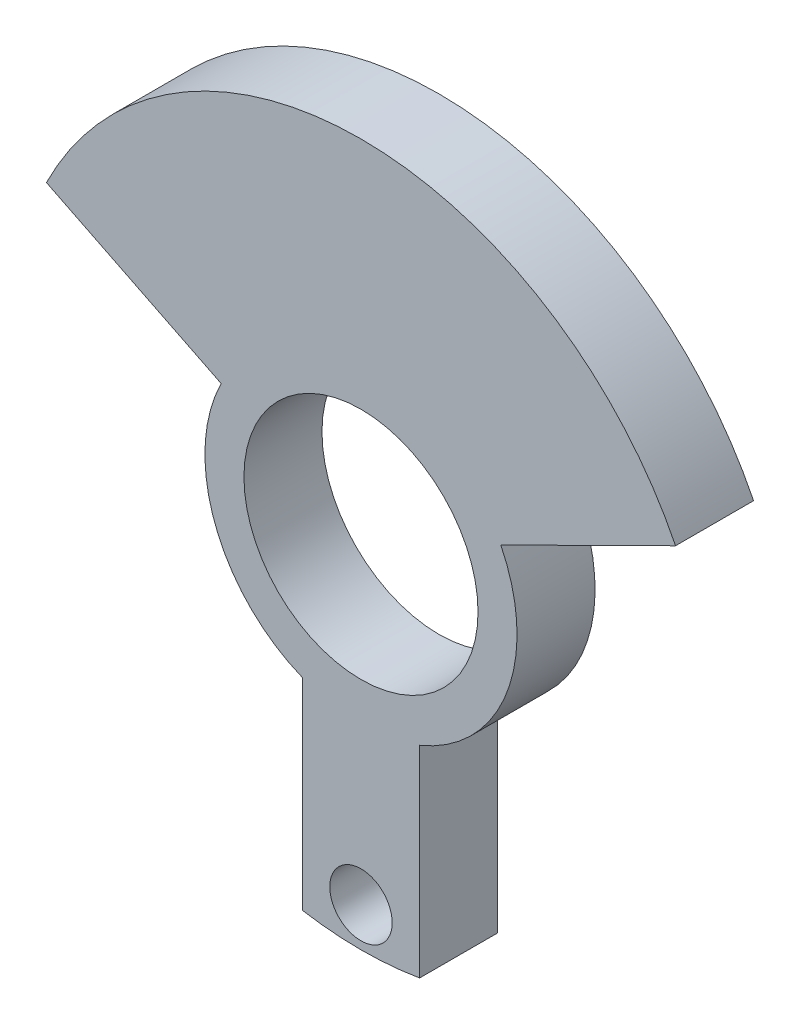
ISO-10303-21;
HEADER;
FILE_DESCRIPTION(('STEP AP214'),'2;1');
FILE_NAME('part.step','',(''),(''),'','','');
FILE_SCHEMA(('AUTOMOTIVE_DESIGN { 1 0 10303 214 1 1 1 1 }'));
ENDSEC;
DATA;
#1=APPLICATION_CONTEXT('core data for automotive mechanical design processes');
#2=APPLICATION_PROTOCOL_DEFINITION('international standard','automotive_design',2000,#1);
#3=PRODUCT_CONTEXT('',#1,'mechanical');
#4=PRODUCT('Part','Part','',(#3));
#5=PRODUCT_RELATED_PRODUCT_CATEGORY('part','',(#4));
#6=PRODUCT_DEFINITION_FORMATION('','',#4);
#7=PRODUCT_DEFINITION_CONTEXT('part definition',#1,'design');
#8=PRODUCT_DEFINITION('design','',#6,#7);
#9=PRODUCT_DEFINITION_SHAPE('','',#8);
#10=(LENGTH_UNIT() NAMED_UNIT(*) SI_UNIT(.MILLI.,.METRE.));
#11=(NAMED_UNIT(*) PLANE_ANGLE_UNIT() SI_UNIT($,.RADIAN.));
#12=(NAMED_UNIT(*) SI_UNIT($,.STERADIAN.) SOLID_ANGLE_UNIT());
#13=UNCERTAINTY_MEASURE_WITH_UNIT(LENGTH_MEASURE(1.E-05),#10,'distance_accuracy_value','');
#14=(GEOMETRIC_REPRESENTATION_CONTEXT(3) GLOBAL_UNCERTAINTY_ASSIGNED_CONTEXT((#13)) GLOBAL_UNIT_ASSIGNED_CONTEXT((#10,
#11,#12)) REPRESENTATION_CONTEXT('',''));
#15=CARTESIAN_POINT('',(0.,0.,0.));
#16=DIRECTION('',(0.,0.,1.));
#17=DIRECTION('',(1.,0.,0.));
#18=AXIS2_PLACEMENT_3D('',#15,#16,#17);
#19=CARTESIAN_POINT('',(0.,0.,5.));
#20=DIRECTION('',(0.,0.,1.));
#21=DIRECTION('',(1.,0.,0.));
#22=AXIS2_PLACEMENT_3D('',#19,#20,#21);
#23=PLANE('',#22);
#24=CARTESIAN_POINT('',(0.,-40.,5.));
#25=DIRECTION('',(0.,0.,1.));
#26=DIRECTION('',(1.,0.,0.));
#27=AXIS2_PLACEMENT_3D('',#24,#25,#26);
#28=CIRCLE('',#27,4.);
#29=CARTESIAN_POINT('',(4.,-40.,5.));
#30=VERTEX_POINT('',#29);
#31=EDGE_CURVE('E185',#30,#30,#28,.T.);
#32=ORIENTED_EDGE('',*,*,#31,.F.);
#33=EDGE_LOOP('',(#32));
#34=FACE_BOUND('',#33,.T.);
#35=CARTESIAN_POINT('',(0.,0.,5.));
#36=DIRECTION('',(0.,0.,1.));
#37=DIRECTION('',(1.,0.,0.));
#38=AXIS2_PLACEMENT_3D('',#35,#36,#37);
#39=CIRCLE('',#38,45.);
#40=CARTESIAN_POINT('',(40.3112887414928,20.,5.));
#41=VERTEX_POINT('',#40);
#42=CARTESIAN_POINT('',(-40.3112887414928,20.,5.));
#43=VERTEX_POINT('',#42);
#44=EDGE_CURVE('E145',#41,#43,#39,.T.);
#45=ORIENTED_EDGE('',*,*,#44,.T.);
#46=DIRECTION('',(0.895806416477617,-0.444444444444445,0.));
#47=VECTOR('',#46,1.);
#48=CARTESIAN_POINT('',(-40.3112887414928,20.,5.));
#49=LINE('',#48,#47);
#50=CARTESIAN_POINT('',(-17.9161283295523,8.88888888888889,5.));
#51=VERTEX_POINT('',#50);
#52=EDGE_CURVE('E93',#43,#51,#49,.T.);
#53=ORIENTED_EDGE('',*,*,#52,.T.);
#54=CARTESIAN_POINT('',(0.,0.,5.));
#55=DIRECTION('',(0.,0.,1.));
#56=DIRECTION('',(1.,0.,0.));
#57=AXIS2_PLACEMENT_3D('',#54,#55,#56);
#58=CIRCLE('',#57,20.);
#59=CARTESIAN_POINT('',(-7.51279453571881,-18.5353154347066,5.));
#60=VERTEX_POINT('',#59);
#61=EDGE_CURVE('E160',#51,#60,#58,.T.);
#62=ORIENTED_EDGE('',*,*,#61,.T.);
#63=DIRECTION('',(0.,-1.,0.));
#64=VECTOR('',#63,1.);
#65=CARTESIAN_POINT('',(-7.5127945357188,-18.5353154347066,5.));
#66=LINE('',#65,#64);
#67=CARTESIAN_POINT('',(-7.5127945357188,-44.3684338044975,5.));
#68=VERTEX_POINT('',#67);
#69=EDGE_CURVE('E173',#60,#68,#66,.T.);
#70=ORIENTED_EDGE('',*,*,#69,.T.);
#71=CARTESIAN_POINT('',(0.,0.,5.));
#72=DIRECTION('',(0.,0.,1.));
#73=DIRECTION('',(1.,0.,0.));
#74=AXIS2_PLACEMENT_3D('',#71,#72,#73);
#75=CIRCLE('',#74,45.);
#76=CARTESIAN_POINT('',(7.51279453571877,-44.3684338044975,5.));
#77=VERTEX_POINT('',#76);
#78=EDGE_CURVE('E112',#68,#77,#75,.T.);
#79=ORIENTED_EDGE('',*,*,#78,.T.);
#80=DIRECTION('',(0.,1.,0.));
#81=VECTOR('',#80,1.);
#82=CARTESIAN_POINT('',(7.5127945357188,-18.5353154347066,5.));
#83=LINE('',#82,#81);
#84=CARTESIAN_POINT('',(7.5127945357188,-18.5353154347066,5.));
#85=VERTEX_POINT('',#84);
#86=EDGE_CURVE('E106',#77,#85,#83,.T.);
#87=ORIENTED_EDGE('',*,*,#86,.T.);
#88=CARTESIAN_POINT('',(0.,0.,5.));
#89=DIRECTION('',(0.,0.,1.));
#90=DIRECTION('',(1.,0.,0.));
#91=AXIS2_PLACEMENT_3D('',#88,#89,#90);
#92=CIRCLE('',#91,20.);
#93=CARTESIAN_POINT('',(17.9161283295523,8.88888888888888,5.));
#94=VERTEX_POINT('',#93);
#95=EDGE_CURVE('E110',#85,#94,#92,.T.);
#96=ORIENTED_EDGE('',*,*,#95,.T.);
#97=DIRECTION('',(0.895806416477617,0.444444444444445,0.));
#98=VECTOR('',#97,1.);
#99=CARTESIAN_POINT('',(40.3112887414928,20.,5.));
#100=LINE('',#99,#98);
#101=EDGE_CURVE('E50',#94,#41,#100,.T.);
#102=ORIENTED_EDGE('',*,*,#101,.T.);
#103=EDGE_LOOP('',(#45,#53,#62,#70,#79,#87,#96,#102));
#104=FACE_BOUND('',#103,.T.);
#105=CARTESIAN_POINT('',(0.,0.,5.));
#106=DIRECTION('',(0.,0.,1.));
#107=DIRECTION('',(1.,0.,0.));
#108=AXIS2_PLACEMENT_3D('',#105,#106,#107);
#109=CIRCLE('',#108,15.);
#110=CARTESIAN_POINT('',(15.,0.,5.));
#111=VERTEX_POINT('',#110);
#112=EDGE_CURVE('E134',#111,#111,#109,.T.);
#113=ORIENTED_EDGE('',*,*,#112,.F.);
#114=EDGE_LOOP('',(#113));
#115=FACE_BOUND('',#114,.T.);
#116=ADVANCED_FACE('F33',(#34,#104,#115),#23,.T.);
#117=CARTESIAN_POINT('',(0.,0.,-5.));
#118=DIRECTION('',(0.,0.,1.));
#119=DIRECTION('',(1.,0.,0.));
#120=AXIS2_PLACEMENT_3D('',#117,#118,#119);
#121=PLANE('',#120);
#122=CARTESIAN_POINT('',(0.,-40.,-5.));
#123=DIRECTION('',(0.,0.,1.));
#124=DIRECTION('',(1.,0.,0.));
#125=AXIS2_PLACEMENT_3D('',#122,#123,#124);
#126=CIRCLE('',#125,4.);
#127=CARTESIAN_POINT('',(4.,-40.,-5.));
#128=VERTEX_POINT('',#127);
#129=EDGE_CURVE('E182',#128,#128,#126,.T.);
#130=ORIENTED_EDGE('',*,*,#129,.T.);
#131=EDGE_LOOP('',(#130));
#132=FACE_BOUND('',#131,.T.);
#133=CARTESIAN_POINT('',(0.,0.,-5.));
#134=DIRECTION('',(0.,0.,1.));
#135=DIRECTION('',(1.,0.,0.));
#136=AXIS2_PLACEMENT_3D('',#133,#134,#135);
#137=CIRCLE('',#136,45.);
#138=CARTESIAN_POINT('',(40.3112887414928,20.,-5.));
#139=VERTEX_POINT('',#138);
#140=CARTESIAN_POINT('',(-40.3112887414928,20.,-5.));
#141=VERTEX_POINT('',#140);
#142=EDGE_CURVE('E130',#139,#141,#137,.T.);
#143=ORIENTED_EDGE('',*,*,#142,.F.);
#144=DIRECTION('',(0.895806416477617,0.444444444444445,0.));
#145=VECTOR('',#144,1.);
#146=CARTESIAN_POINT('',(40.3112887414928,20.,-5.));
#147=LINE('',#146,#145);
#148=CARTESIAN_POINT('',(17.9161283295523,8.88888888888888,-5.));
#149=VERTEX_POINT('',#148);
#150=EDGE_CURVE('E85',#149,#139,#147,.T.);
#151=ORIENTED_EDGE('',*,*,#150,.F.);
#152=CARTESIAN_POINT('',(0.,0.,-5.));
#153=DIRECTION('',(0.,0.,1.));
#154=DIRECTION('',(1.,0.,0.));
#155=AXIS2_PLACEMENT_3D('',#152,#153,#154);
#156=CIRCLE('',#155,20.);
#157=CARTESIAN_POINT('',(7.5127945357188,-18.5353154347066,-5.));
#158=VERTEX_POINT('',#157);
#159=EDGE_CURVE('E79',#158,#149,#156,.T.);
#160=ORIENTED_EDGE('',*,*,#159,.F.);
#161=DIRECTION('',(0.,1.,0.));
#162=VECTOR('',#161,1.);
#163=CARTESIAN_POINT('',(7.5127945357188,-18.5353154347066,-5.));
#164=LINE('',#163,#162);
#165=CARTESIAN_POINT('',(7.51279453571877,-44.3684338044975,-5.));
#166=VERTEX_POINT('',#165);
#167=EDGE_CURVE('E120',#166,#158,#164,.T.);
#168=ORIENTED_EDGE('',*,*,#167,.F.);
#169=CARTESIAN_POINT('',(0.,0.,-5.));
#170=DIRECTION('',(0.,0.,1.));
#171=DIRECTION('',(1.,0.,0.));
#172=AXIS2_PLACEMENT_3D('',#169,#170,#171);
#173=CIRCLE('',#172,45.);
#174=CARTESIAN_POINT('',(-7.5127945357188,-44.3684338044975,-5.));
#175=VERTEX_POINT('',#174);
#176=EDGE_CURVE('E140',#175,#166,#173,.T.);
#177=ORIENTED_EDGE('',*,*,#176,.F.);
#178=DIRECTION('',(0.,-1.,0.));
#179=VECTOR('',#178,1.);
#180=CARTESIAN_POINT('',(-7.5127945357188,-18.5353154347066,-5.));
#181=LINE('',#180,#179);
#182=CARTESIAN_POINT('',(-7.51279453571881,-18.5353154347066,-5.));
#183=VERTEX_POINT('',#182);
#184=EDGE_CURVE('E138',#183,#175,#181,.T.);
#185=ORIENTED_EDGE('',*,*,#184,.F.);
#186=CARTESIAN_POINT('',(0.,0.,-5.));
#187=DIRECTION('',(0.,0.,1.));
#188=DIRECTION('',(1.,0.,0.));
#189=AXIS2_PLACEMENT_3D('',#186,#187,#188);
#190=CIRCLE('',#189,20.);
#191=CARTESIAN_POINT('',(-17.9161283295523,8.88888888888889,-5.));
#192=VERTEX_POINT('',#191);
#193=EDGE_CURVE('E136',#192,#183,#190,.T.);
#194=ORIENTED_EDGE('',*,*,#193,.F.);
#195=DIRECTION('',(0.895806416477617,-0.444444444444445,0.));
#196=VECTOR('',#195,1.);
#197=CARTESIAN_POINT('',(-40.3112887414928,20.,-5.));
#198=LINE('',#197,#196);
#199=EDGE_CURVE('E133',#141,#192,#198,.T.);
#200=ORIENTED_EDGE('',*,*,#199,.F.);
#201=EDGE_LOOP('',(#143,#151,#160,#168,#177,#185,#194,#200));
#202=FACE_BOUND('',#201,.T.);
#203=CARTESIAN_POINT('',(0.,0.,-5.));
#204=DIRECTION('',(0.,0.,1.));
#205=DIRECTION('',(1.,0.,0.));
#206=AXIS2_PLACEMENT_3D('',#203,#204,#205);
#207=CIRCLE('',#206,15.);
#208=CARTESIAN_POINT('',(15.,0.,-5.));
#209=VERTEX_POINT('',#208);
#210=EDGE_CURVE('E179',#209,#209,#207,.T.);
#211=ORIENTED_EDGE('',*,*,#210,.T.);
#212=EDGE_LOOP('',(#211));
#213=FACE_BOUND('',#212,.T.);
#214=ADVANCED_FACE('F164',(#132,#202,#213),#121,.F.);
#215=CARTESIAN_POINT('',(0.,0.,5.));
#216=DIRECTION('',(0.,0.,-1.));
#217=DIRECTION('',(-1.,0.,0.));
#218=AXIS2_PLACEMENT_3D('',#215,#216,#217);
#219=CYLINDRICAL_SURFACE('',#218,45.);
#220=ORIENTED_EDGE('',*,*,#142,.T.);
#221=DIRECTION('',(0.,0.,-1.));
#222=VECTOR('',#221,1.);
#223=CARTESIAN_POINT('',(-40.3112887414928,20.,5.));
#224=LINE('',#223,#222);
#225=EDGE_CURVE('E11',#43,#141,#224,.T.);
#226=ORIENTED_EDGE('',*,*,#225,.F.);
#227=ORIENTED_EDGE('',*,*,#44,.F.);
#228=DIRECTION('',(0.,0.,-1.));
#229=VECTOR('',#228,1.);
#230=CARTESIAN_POINT('',(40.3112887414928,20.,5.));
#231=LINE('',#230,#229);
#232=EDGE_CURVE('E126',#41,#139,#231,.T.);
#233=ORIENTED_EDGE('',*,*,#232,.T.);
#234=EDGE_LOOP('',(#220,#226,#227,#233));
#235=FACE_BOUND('',#234,.T.);
#236=ADVANCED_FACE('F35',(#235),#219,.T.);
#237=CARTESIAN_POINT('',(-40.3112887414928,20.,5.));
#238=DIRECTION('',(0.444444444444445,0.895806416477617,0.));
#239=DIRECTION('',(-0.895806416477617,0.444444444444445,0.));
#240=AXIS2_PLACEMENT_3D('',#237,#238,#239);
#241=PLANE('',#240);
#242=ORIENTED_EDGE('',*,*,#199,.T.);
#243=DIRECTION('',(0.,0.,-1.));
#244=VECTOR('',#243,1.);
#245=CARTESIAN_POINT('',(-17.9161283295523,8.88888888888889,5.));
#246=LINE('',#245,#244);
#247=EDGE_CURVE('E42',#51,#192,#246,.T.);
#248=ORIENTED_EDGE('',*,*,#247,.F.);
#249=ORIENTED_EDGE('',*,*,#52,.F.);
#250=ORIENTED_EDGE('',*,*,#225,.T.);
#251=EDGE_LOOP('',(#242,#248,#249,#250));
#252=FACE_BOUND('',#251,.T.);
#253=ADVANCED_FACE('F219',(#252),#241,.F.);
#254=CARTESIAN_POINT('',(0.,0.,5.));
#255=DIRECTION('',(0.,0.,-1.));
#256=DIRECTION('',(-1.,0.,0.));
#257=AXIS2_PLACEMENT_3D('',#254,#255,#256);
#258=CYLINDRICAL_SURFACE('',#257,20.);
#259=ORIENTED_EDGE('',*,*,#193,.T.);
#260=DIRECTION('',(0.,0.,-1.));
#261=VECTOR('',#260,1.);
#262=CARTESIAN_POINT('',(-7.51279453571881,-18.5353154347066,5.));
#263=LINE('',#262,#261);
#264=EDGE_CURVE('E152',#60,#183,#263,.T.);
#265=ORIENTED_EDGE('',*,*,#264,.F.);
#266=ORIENTED_EDGE('',*,*,#61,.F.);
#267=ORIENTED_EDGE('',*,*,#247,.T.);
#268=EDGE_LOOP('',(#259,#265,#266,#267));
#269=FACE_BOUND('',#268,.T.);
#270=ADVANCED_FACE('F158',(#269),#258,.T.);
#271=CARTESIAN_POINT('',(-7.5127945357188,-18.5353154347066,5.));
#272=DIRECTION('',(1.,0.,0.));
#273=DIRECTION('',(0.,0.,-1.));
#274=AXIS2_PLACEMENT_3D('',#271,#272,#273);
#275=PLANE('',#274);
#276=ORIENTED_EDGE('',*,*,#184,.T.);
#277=DIRECTION('',(0.,0.,-1.));
#278=VECTOR('',#277,1.);
#279=CARTESIAN_POINT('',(-7.5127945357188,-44.3684338044975,5.));
#280=LINE('',#279,#278);
#281=EDGE_CURVE('E149',#68,#175,#280,.T.);
#282=ORIENTED_EDGE('',*,*,#281,.F.);
#283=ORIENTED_EDGE('',*,*,#69,.F.);
#284=ORIENTED_EDGE('',*,*,#264,.T.);
#285=EDGE_LOOP('',(#276,#282,#283,#284));
#286=FACE_BOUND('',#285,.T.);
#287=ADVANCED_FACE('F169',(#286),#275,.F.);
#288=CARTESIAN_POINT('',(0.,0.,5.));
#289=DIRECTION('',(0.,0.,-1.));
#290=DIRECTION('',(-1.,0.,0.));
#291=AXIS2_PLACEMENT_3D('',#288,#289,#290);
#292=CYLINDRICAL_SURFACE('',#291,45.);
#293=ORIENTED_EDGE('',*,*,#176,.T.);
#294=DIRECTION('',(0.,0.,-1.));
#295=VECTOR('',#294,1.);
#296=CARTESIAN_POINT('',(7.51279453571877,-44.3684338044975,5.));
#297=LINE('',#296,#295);
#298=EDGE_CURVE('E121',#77,#166,#297,.T.);
#299=ORIENTED_EDGE('',*,*,#298,.F.);
#300=ORIENTED_EDGE('',*,*,#78,.F.);
#301=ORIENTED_EDGE('',*,*,#281,.T.);
#302=EDGE_LOOP('',(#293,#299,#300,#301));
#303=FACE_BOUND('',#302,.T.);
#304=ADVANCED_FACE('F172',(#303),#292,.T.);
#305=CARTESIAN_POINT('',(7.5127945357188,-18.5353154347066,5.));
#306=DIRECTION('',(-1.,0.,0.));
#307=DIRECTION('',(0.,0.,1.));
#308=AXIS2_PLACEMENT_3D('',#305,#306,#307);
#309=PLANE('',#308);
#310=ORIENTED_EDGE('',*,*,#167,.T.);
#311=DIRECTION('',(0.,0.,-1.));
#312=VECTOR('',#311,1.);
#313=CARTESIAN_POINT('',(7.5127945357188,-18.5353154347066,5.));
#314=LINE('',#313,#312);
#315=EDGE_CURVE('E117',#85,#158,#314,.T.);
#316=ORIENTED_EDGE('',*,*,#315,.F.);
#317=ORIENTED_EDGE('',*,*,#86,.F.);
#318=ORIENTED_EDGE('',*,*,#298,.T.);
#319=EDGE_LOOP('',(#310,#316,#317,#318));
#320=FACE_BOUND('',#319,.T.);
#321=ADVANCED_FACE('F118',(#320),#309,.F.);
#322=CARTESIAN_POINT('',(0.,0.,5.));
#323=DIRECTION('',(0.,0.,-1.));
#324=DIRECTION('',(-1.,0.,0.));
#325=AXIS2_PLACEMENT_3D('',#322,#323,#324);
#326=CYLINDRICAL_SURFACE('',#325,20.);
#327=ORIENTED_EDGE('',*,*,#159,.T.);
#328=DIRECTION('',(0.,0.,-1.));
#329=VECTOR('',#328,1.);
#330=CARTESIAN_POINT('',(17.9161283295523,8.88888888888888,5.));
#331=LINE('',#330,#329);
#332=EDGE_CURVE('E122',#94,#149,#331,.T.);
#333=ORIENTED_EDGE('',*,*,#332,.F.);
#334=ORIENTED_EDGE('',*,*,#95,.F.);
#335=ORIENTED_EDGE('',*,*,#315,.T.);
#336=EDGE_LOOP('',(#327,#333,#334,#335));
#337=FACE_BOUND('',#336,.T.);
#338=ADVANCED_FACE('F124',(#337),#326,.T.);
#339=CARTESIAN_POINT('',(40.3112887414928,20.,5.));
#340=DIRECTION('',(-0.444444444444445,0.895806416477617,0.));
#341=DIRECTION('',(-0.895806416477617,-0.444444444444445,0.));
#342=AXIS2_PLACEMENT_3D('',#339,#340,#341);
#343=PLANE('',#342);
#344=ORIENTED_EDGE('',*,*,#150,.T.);
#345=ORIENTED_EDGE('',*,*,#232,.F.);
#346=ORIENTED_EDGE('',*,*,#101,.F.);
#347=ORIENTED_EDGE('',*,*,#332,.T.);
#348=EDGE_LOOP('',(#344,#345,#346,#347));
#349=FACE_BOUND('',#348,.T.);
#350=ADVANCED_FACE('F207',(#349),#343,.F.);
#351=CARTESIAN_POINT('',(0.,0.,5.));
#352=DIRECTION('',(0.,0.,-1.));
#353=DIRECTION('',(-1.,0.,0.));
#354=AXIS2_PLACEMENT_3D('',#351,#352,#353);
#355=CYLINDRICAL_SURFACE('',#354,15.);
#356=ORIENTED_EDGE('',*,*,#112,.T.);
#357=EDGE_LOOP('',(#356));
#358=FACE_BOUND('',#357,.T.);
#359=ORIENTED_EDGE('',*,*,#210,.F.);
#360=EDGE_LOOP('',(#359));
#361=FACE_BOUND('',#360,.T.);
#362=ADVANCED_FACE('F195',(#358,#361),#355,.F.);
#363=CARTESIAN_POINT('',(0.,-40.,-5.));
#364=DIRECTION('',(0.,0.,1.));
#365=DIRECTION('',(1.,0.,0.));
#366=AXIS2_PLACEMENT_3D('',#363,#364,#365);
#367=CYLINDRICAL_SURFACE('',#366,4.);
#368=ORIENTED_EDGE('',*,*,#129,.F.);
#369=EDGE_LOOP('',(#368));
#370=FACE_BOUND('',#369,.T.);
#371=ORIENTED_EDGE('',*,*,#31,.T.);
#372=EDGE_LOOP('',(#371));
#373=FACE_BOUND('',#372,.T.);
#374=ADVANCED_FACE('F192',(#370,#373),#367,.F.);
#375=CLOSED_SHELL('',(#116,#214,#236,#253,#270,#287,#304,#321,#338,#350,#362,#374));
#376=MANIFOLD_SOLID_BREP('B2',#375);
#377=ADVANCED_BREP_SHAPE_REPRESENTATION('',(#18,#376),#14);
#378=SHAPE_DEFINITION_REPRESENTATION(#9,#377);
ENDSEC;
END-ISO-10303-21;
